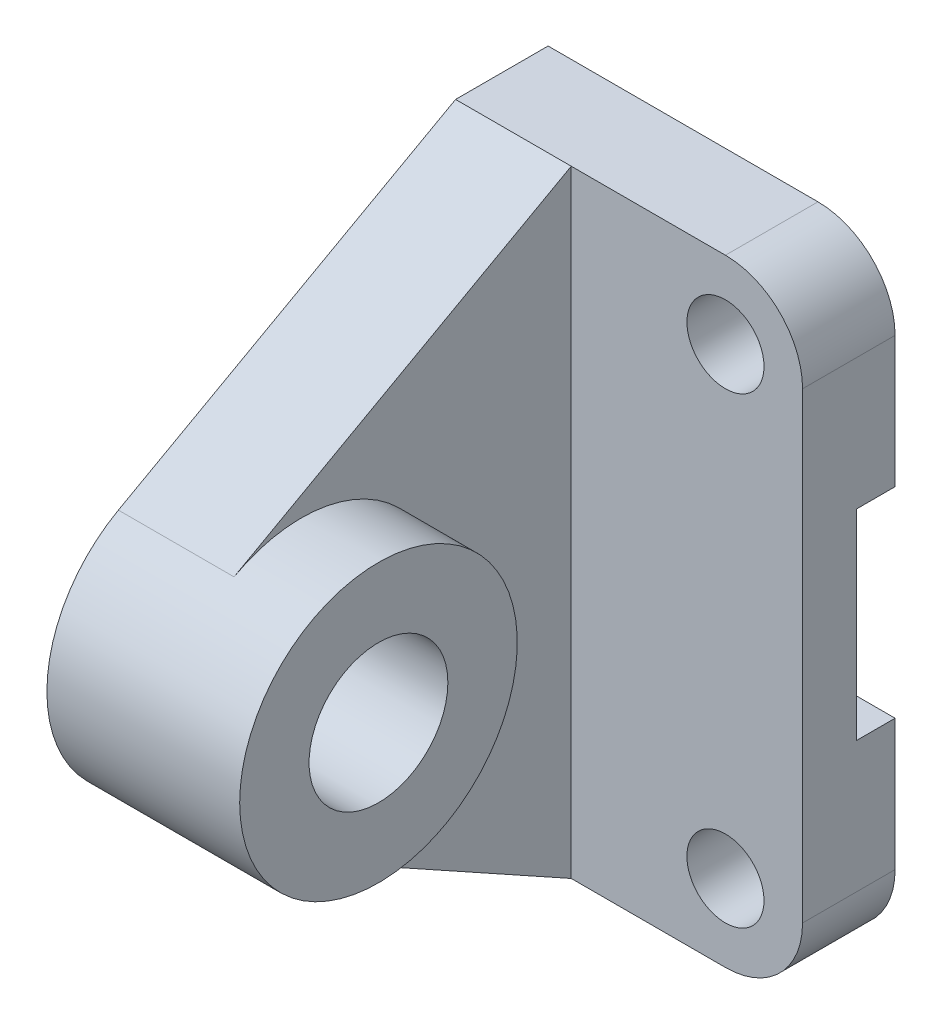
ISO-10303-21;
HEADER;
FILE_DESCRIPTION(('STEP AP214'),'2;1');
FILE_NAME('part.step','',(''),(''),'','','');
FILE_SCHEMA(('AUTOMOTIVE_DESIGN { 1 0 10303 214 1 1 1 1 }'));
ENDSEC;
DATA;
#1=APPLICATION_CONTEXT('core data for automotive mechanical design processes');
#2=APPLICATION_PROTOCOL_DEFINITION('international standard','automotive_design',2000,#1);
#3=PRODUCT_CONTEXT('',#1,'mechanical');
#4=PRODUCT('Part','Part','',(#3));
#5=PRODUCT_RELATED_PRODUCT_CATEGORY('part','',(#4));
#6=PRODUCT_DEFINITION_FORMATION('','',#4);
#7=PRODUCT_DEFINITION_CONTEXT('part definition',#1,'design');
#8=PRODUCT_DEFINITION('design','',#6,#7);
#9=PRODUCT_DEFINITION_SHAPE('','',#8);
#10=(LENGTH_UNIT() NAMED_UNIT(*) SI_UNIT(.MILLI.,.METRE.));
#11=(NAMED_UNIT(*) PLANE_ANGLE_UNIT() SI_UNIT($,.RADIAN.));
#12=(NAMED_UNIT(*) SI_UNIT($,.STERADIAN.) SOLID_ANGLE_UNIT());
#13=UNCERTAINTY_MEASURE_WITH_UNIT(LENGTH_MEASURE(1.E-05),#10,'distance_accuracy_value','');
#14=(GEOMETRIC_REPRESENTATION_CONTEXT(3) GLOBAL_UNCERTAINTY_ASSIGNED_CONTEXT((#13)) GLOBAL_UNIT_ASSIGNED_CONTEXT((#10,
#11,#12)) REPRESENTATION_CONTEXT('',''));
#15=CARTESIAN_POINT('',(0.,0.,0.));
#16=DIRECTION('',(0.,0.,1.));
#17=DIRECTION('',(1.,0.,0.));
#18=AXIS2_PLACEMENT_3D('',#15,#16,#17);
#19=CARTESIAN_POINT('',(45.,40.,0.));
#20=DIRECTION('',(0.,0.,1.));
#21=DIRECTION('',(1.,0.,0.));
#22=AXIS2_PLACEMENT_3D('',#19,#20,#21);
#23=PLANE('',#22);
#24=CARTESIAN_POINT('',(35.,30.,0.));
#25=DIRECTION('',(0.,0.,1.));
#26=DIRECTION('',(1.,0.,0.));
#27=AXIS2_PLACEMENT_3D('',#24,#25,#26);
#28=CIRCLE('',#27,5.);
#29=CARTESIAN_POINT('',(40.,30.,0.));
#30=VERTEX_POINT('',#29);
#31=EDGE_CURVE('E189',#30,#30,#28,.T.);
#32=ORIENTED_EDGE('',*,*,#31,.T.);
#33=EDGE_LOOP('',(#32));
#34=FACE_BOUND('',#33,.T.);
#35=DIRECTION('',(0.,1.,0.));
#36=VECTOR('',#35,1.);
#37=CARTESIAN_POINT('',(45.,40.,0.));
#38=LINE('',#37,#36);
#39=CARTESIAN_POINT('',(45.,13.,0.));
#40=VERTEX_POINT('',#39);
#41=CARTESIAN_POINT('',(45.,30.,0.));
#42=VERTEX_POINT('',#41);
#43=EDGE_CURVE('E205',#40,#42,#38,.T.);
#44=ORIENTED_EDGE('',*,*,#43,.F.);
#45=DIRECTION('',(-1.,0.,0.));
#46=VECTOR('',#45,1.);
#47=CARTESIAN_POINT('',(45.,13.,0.));
#48=LINE('',#47,#46);
#49=CARTESIAN_POINT('',(0.,13.,0.));
#50=VERTEX_POINT('',#49);
#51=EDGE_CURVE('E185',#40,#50,#48,.T.);
#52=ORIENTED_EDGE('',*,*,#51,.T.);
#53=DIRECTION('',(0.,1.,0.));
#54=VECTOR('',#53,1.);
#55=CARTESIAN_POINT('',(0.,40.,0.));
#56=LINE('',#55,#54);
#57=CARTESIAN_POINT('',(0.,40.,0.));
#58=VERTEX_POINT('',#57);
#59=EDGE_CURVE('E192',#50,#58,#56,.T.);
#60=ORIENTED_EDGE('',*,*,#59,.T.);
#61=DIRECTION('',(-1.,0.,0.));
#62=VECTOR('',#61,1.);
#63=CARTESIAN_POINT('',(45.,40.,0.));
#64=LINE('',#63,#62);
#65=CARTESIAN_POINT('',(35.,40.,0.));
#66=VERTEX_POINT('',#65);
#67=EDGE_CURVE('E225',#66,#58,#64,.T.);
#68=ORIENTED_EDGE('',*,*,#67,.F.);
#69=CARTESIAN_POINT('',(35.,30.,0.));
#70=DIRECTION('',(0.,0.,1.));
#71=DIRECTION('',(1.,0.,0.));
#72=AXIS2_PLACEMENT_3D('',#69,#70,#71);
#73=CIRCLE('',#72,10.);
#74=EDGE_CURVE('E242',#66,#42,#73,.F.);
#75=ORIENTED_EDGE('',*,*,#74,.T.);
#76=EDGE_LOOP('',(#44,#52,#60,#68,#75));
#77=FACE_BOUND('',#76,.T.);
#78=ADVANCED_FACE('F37',(#34,#77),#23,.F.);
#79=CARTESIAN_POINT('',(35.,-30.,0.));
#80=DIRECTION('',(0.,0.,1.));
#81=DIRECTION('',(1.,0.,0.));
#82=AXIS2_PLACEMENT_3D('',#79,#80,#81);
#83=CIRCLE('',#82,5.);
#84=CARTESIAN_POINT('',(40.,-30.,0.));
#85=VERTEX_POINT('',#84);
#86=EDGE_CURVE('E196',#85,#85,#83,.T.);
#87=ORIENTED_EDGE('',*,*,#86,.T.);
#88=EDGE_LOOP('',(#87));
#89=FACE_BOUND('',#88,.T.);
#90=CARTESIAN_POINT('',(0.,-40.,0.));
#91=VERTEX_POINT('',#90);
#92=CARTESIAN_POINT('',(0.,-13.,0.));
#93=VERTEX_POINT('',#92);
#94=EDGE_CURVE('E209',#91,#93,#56,.T.);
#95=ORIENTED_EDGE('',*,*,#94,.T.);
#96=DIRECTION('',(1.,0.,0.));
#97=VECTOR('',#96,1.);
#98=CARTESIAN_POINT('',(45.,-13.,0.));
#99=LINE('',#98,#97);
#100=CARTESIAN_POINT('',(45.,-13.,0.));
#101=VERTEX_POINT('',#100);
#102=EDGE_CURVE('E59',#93,#101,#99,.T.);
#103=ORIENTED_EDGE('',*,*,#102,.T.);
#104=CARTESIAN_POINT('',(45.,-30.,0.));
#105=VERTEX_POINT('',#104);
#106=EDGE_CURVE('E201',#105,#101,#38,.T.);
#107=ORIENTED_EDGE('',*,*,#106,.F.);
#108=CARTESIAN_POINT('',(35.,-30.,0.));
#109=DIRECTION('',(0.,0.,1.));
#110=DIRECTION('',(1.,0.,0.));
#111=AXIS2_PLACEMENT_3D('',#108,#109,#110);
#112=CIRCLE('',#111,10.);
#113=CARTESIAN_POINT('',(35.,-40.,0.));
#114=VERTEX_POINT('',#113);
#115=EDGE_CURVE('E240',#105,#114,#112,.F.);
#116=ORIENTED_EDGE('',*,*,#115,.T.);
#117=DIRECTION('',(-1.,0.,0.));
#118=VECTOR('',#117,1.);
#119=CARTESIAN_POINT('',(45.,-40.,0.));
#120=LINE('',#119,#118);
#121=EDGE_CURVE('E208',#114,#91,#120,.T.);
#122=ORIENTED_EDGE('',*,*,#121,.T.);
#123=EDGE_LOOP('',(#95,#103,#107,#116,#122));
#124=FACE_BOUND('',#123,.T.);
#125=ADVANCED_FACE('F271',(#89,#124),#23,.F.);
#126=CARTESIAN_POINT('',(45.,40.,0.));
#127=DIRECTION('',(0.,-1.,0.));
#128=DIRECTION('',(0.,0.,-1.));
#129=AXIS2_PLACEMENT_3D('',#126,#127,#128);
#130=PLANE('',#129);
#131=DIRECTION('',(-1.,0.,0.));
#132=VECTOR('',#131,1.);
#133=CARTESIAN_POINT('',(45.,40.,12.));
#134=LINE('',#133,#132);
#135=CARTESIAN_POINT('',(35.,40.,12.));
#136=VERTEX_POINT('',#135);
#137=CARTESIAN_POINT('',(15.,40.,12.));
#138=VERTEX_POINT('',#137);
#139=EDGE_CURVE('E222',#136,#138,#134,.T.);
#140=ORIENTED_EDGE('',*,*,#139,.F.);
#141=DIRECTION('',(0.,0.,1.));
#142=VECTOR('',#141,1.);
#143=CARTESIAN_POINT('',(35.,40.,0.));
#144=LINE('',#143,#142);
#145=EDGE_CURVE('E238',#136,#66,#144,.F.);
#146=ORIENTED_EDGE('',*,*,#145,.T.);
#147=ORIENTED_EDGE('',*,*,#67,.T.);
#148=DIRECTION('',(0.,0.,1.));
#149=VECTOR('',#148,1.);
#150=CARTESIAN_POINT('',(0.,40.,0.));
#151=LINE('',#150,#149);
#152=CARTESIAN_POINT('',(0.,40.,12.));
#153=VERTEX_POINT('',#152);
#154=EDGE_CURVE('E212',#58,#153,#151,.T.);
#155=ORIENTED_EDGE('',*,*,#154,.T.);
#156=DIRECTION('',(-1.,0.,0.));
#157=VECTOR('',#156,1.);
#158=CARTESIAN_POINT('',(15.,40.,12.));
#159=LINE('',#158,#157);
#160=EDGE_CURVE('E163',#138,#153,#159,.T.);
#161=ORIENTED_EDGE('',*,*,#160,.F.);
#162=EDGE_LOOP('',(#140,#146,#147,#155,#161));
#163=FACE_BOUND('',#162,.T.);
#164=ADVANCED_FACE('F283',(#163),#130,.F.);
#165=CARTESIAN_POINT('',(45.,40.,12.));
#166=DIRECTION('',(0.,0.,-1.));
#167=DIRECTION('',(-1.,0.,0.));
#168=AXIS2_PLACEMENT_3D('',#165,#166,#167);
#169=PLANE('',#168);
#170=CARTESIAN_POINT('',(35.,30.,12.));
#171=DIRECTION('',(0.,0.,1.));
#172=DIRECTION('',(1.,0.,0.));
#173=AXIS2_PLACEMENT_3D('',#170,#171,#172);
#174=CIRCLE('',#173,5.);
#175=CARTESIAN_POINT('',(40.,30.,12.));
#176=VERTEX_POINT('',#175);
#177=EDGE_CURVE('E193',#176,#176,#174,.T.);
#178=ORIENTED_EDGE('',*,*,#177,.F.);
#179=EDGE_LOOP('',(#178));
#180=FACE_BOUND('',#179,.T.);
#181=CARTESIAN_POINT('',(35.,-30.,12.));
#182=DIRECTION('',(0.,0.,1.));
#183=DIRECTION('',(1.,0.,0.));
#184=AXIS2_PLACEMENT_3D('',#181,#182,#183);
#185=CIRCLE('',#184,5.);
#186=CARTESIAN_POINT('',(40.,-30.,12.));
#187=VERTEX_POINT('',#186);
#188=EDGE_CURVE('E188',#187,#187,#185,.T.);
#189=ORIENTED_EDGE('',*,*,#188,.F.);
#190=EDGE_LOOP('',(#189));
#191=FACE_BOUND('',#190,.T.);
#192=ORIENTED_EDGE('',*,*,#139,.T.);
#193=DIRECTION('',(0.,-1.,0.));
#194=VECTOR('',#193,1.);
#195=CARTESIAN_POINT('',(15.,40.,12.));
#196=LINE('',#195,#194);
#197=CARTESIAN_POINT('',(15.,-40.,12.));
#198=VERTEX_POINT('',#197);
#199=EDGE_CURVE('E150',#138,#198,#196,.T.);
#200=ORIENTED_EDGE('',*,*,#199,.T.);
#201=DIRECTION('',(-1.,0.,0.));
#202=VECTOR('',#201,1.);
#203=CARTESIAN_POINT('',(45.,-40.,12.));
#204=LINE('',#203,#202);
#205=CARTESIAN_POINT('',(35.,-40.,12.));
#206=VERTEX_POINT('',#205);
#207=EDGE_CURVE('E219',#206,#198,#204,.T.);
#208=ORIENTED_EDGE('',*,*,#207,.F.);
#209=CARTESIAN_POINT('',(35.,-30.,12.));
#210=DIRECTION('',(0.,0.,-1.));
#211=DIRECTION('',(-1.,0.,0.));
#212=AXIS2_PLACEMENT_3D('',#209,#210,#211);
#213=CIRCLE('',#212,10.);
#214=CARTESIAN_POINT('',(45.,-30.,12.));
#215=VERTEX_POINT('',#214);
#216=EDGE_CURVE('E234',#206,#215,#213,.F.);
#217=ORIENTED_EDGE('',*,*,#216,.T.);
#218=DIRECTION('',(0.,-1.,0.));
#219=VECTOR('',#218,1.);
#220=CARTESIAN_POINT('',(45.,40.,12.));
#221=LINE('',#220,#219);
#222=CARTESIAN_POINT('',(45.,30.,12.));
#223=VERTEX_POINT('',#222);
#224=EDGE_CURVE('E204',#223,#215,#221,.T.);
#225=ORIENTED_EDGE('',*,*,#224,.F.);
#226=CARTESIAN_POINT('',(35.,30.,12.));
#227=DIRECTION('',(0.,0.,-1.));
#228=DIRECTION('',(-1.,0.,0.));
#229=AXIS2_PLACEMENT_3D('',#226,#227,#228);
#230=CIRCLE('',#229,10.);
#231=EDGE_CURVE('E236',#223,#136,#230,.F.);
#232=ORIENTED_EDGE('',*,*,#231,.T.);
#233=EDGE_LOOP('',(#192,#200,#208,#217,#225,#232));
#234=FACE_BOUND('',#233,.T.);
#235=ADVANCED_FACE('F286',(#180,#191,#234),#169,.F.);
#236=CARTESIAN_POINT('',(45.,-40.,12.));
#237=DIRECTION('',(0.,1.,0.));
#238=DIRECTION('',(0.,0.,1.));
#239=AXIS2_PLACEMENT_3D('',#236,#237,#238);
#240=PLANE('',#239);
#241=ORIENTED_EDGE('',*,*,#121,.F.);
#242=DIRECTION('',(0.,0.,-1.));
#243=VECTOR('',#242,1.);
#244=CARTESIAN_POINT('',(35.,-40.,12.));
#245=LINE('',#244,#243);
#246=EDGE_CURVE('E245',#114,#206,#245,.F.);
#247=ORIENTED_EDGE('',*,*,#246,.T.);
#248=ORIENTED_EDGE('',*,*,#207,.T.);
#249=DIRECTION('',(-1.,0.,0.));
#250=VECTOR('',#249,1.);
#251=CARTESIAN_POINT('',(15.,-40.,12.));
#252=LINE('',#251,#250);
#253=CARTESIAN_POINT('',(0.,-40.,12.));
#254=VERTEX_POINT('',#253);
#255=EDGE_CURVE('E145',#198,#254,#252,.T.);
#256=ORIENTED_EDGE('',*,*,#255,.T.);
#257=DIRECTION('',(0.,0.,-1.));
#258=VECTOR('',#257,1.);
#259=CARTESIAN_POINT('',(0.,-40.,12.));
#260=LINE('',#259,#258);
#261=EDGE_CURVE('E215',#254,#91,#260,.T.);
#262=ORIENTED_EDGE('',*,*,#261,.T.);
#263=EDGE_LOOP('',(#241,#247,#248,#256,#262));
#264=FACE_BOUND('',#263,.T.);
#265=ADVANCED_FACE('F276',(#264),#240,.F.);
#266=CARTESIAN_POINT('',(45.,0.,0.));
#267=DIRECTION('',(1.,0.,0.));
#268=DIRECTION('',(0.,0.,-1.));
#269=AXIS2_PLACEMENT_3D('',#266,#267,#268);
#270=PLANE('',#269);
#271=DIRECTION('',(0.,0.,1.));
#272=VECTOR('',#271,1.);
#273=CARTESIAN_POINT('',(45.,13.,-5.));
#274=LINE('',#273,#272);
#275=CARTESIAN_POINT('',(45.,13.,5.));
#276=VERTEX_POINT('',#275);
#277=EDGE_CURVE('E172',#40,#276,#274,.T.);
#278=ORIENTED_EDGE('',*,*,#277,.F.);
#279=ORIENTED_EDGE('',*,*,#43,.T.);
#280=DIRECTION('',(0.,0.,1.));
#281=VECTOR('',#280,1.);
#282=CARTESIAN_POINT('',(45.,30.,12.));
#283=LINE('',#282,#281);
#284=EDGE_CURVE('E231',#42,#223,#283,.T.);
#285=ORIENTED_EDGE('',*,*,#284,.T.);
#286=ORIENTED_EDGE('',*,*,#224,.T.);
#287=DIRECTION('',(0.,0.,-1.));
#288=VECTOR('',#287,1.);
#289=CARTESIAN_POINT('',(45.,-30.,0.));
#290=LINE('',#289,#288);
#291=EDGE_CURVE('E228',#215,#105,#290,.T.);
#292=ORIENTED_EDGE('',*,*,#291,.T.);
#293=ORIENTED_EDGE('',*,*,#106,.T.);
#294=DIRECTION('',(0.,0.,-1.));
#295=VECTOR('',#294,1.);
#296=CARTESIAN_POINT('',(45.,-13.,-5.));
#297=LINE('',#296,#295);
#298=CARTESIAN_POINT('',(45.,-13.,5.));
#299=VERTEX_POINT('',#298);
#300=EDGE_CURVE('E177',#299,#101,#297,.T.);
#301=ORIENTED_EDGE('',*,*,#300,.F.);
#302=DIRECTION('',(0.,-1.,0.));
#303=VECTOR('',#302,1.);
#304=CARTESIAN_POINT('',(45.,-13.,5.));
#305=LINE('',#304,#303);
#306=EDGE_CURVE('E165',#276,#299,#305,.T.);
#307=ORIENTED_EDGE('',*,*,#306,.F.);
#308=EDGE_LOOP('',(#278,#279,#285,#286,#292,#293,#301,#307));
#309=FACE_BOUND('',#308,.T.);
#310=ADVANCED_FACE('F261',(#309),#270,.T.);
#311=CARTESIAN_POINT('',(0.,0.,0.));
#312=DIRECTION('',(1.,0.,0.));
#313=DIRECTION('',(0.,0.,-1.));
#314=AXIS2_PLACEMENT_3D('',#311,#312,#313);
#315=PLANE('',#314);
#316=CARTESIAN_POINT('',(0.,0.,47.));
#317=DIRECTION('',(1.,0.,0.));
#318=DIRECTION('',(0.,0.,-1.));
#319=AXIS2_PLACEMENT_3D('',#316,#317,#318);
#320=CIRCLE('',#319,9.);
#321=CARTESIAN_POINT('',(0.,0.,38.));
#322=VERTEX_POINT('',#321);
#323=EDGE_CURVE('E349',#322,#322,#320,.T.);
#324=ORIENTED_EDGE('',*,*,#323,.T.);
#325=EDGE_LOOP('',(#324));
#326=FACE_BOUND('',#325,.T.);
#327=DIRECTION('',(0.,0.485097330976282,0.874460164604247));
#328=VECTOR('',#327,1.);
#329=CARTESIAN_POINT('',(0.,-40.,12.));
#330=LINE('',#329,#328);
#331=CARTESIAN_POINT('',(0.,-15.7402829628765,55.7317519575731));
#332=VERTEX_POINT('',#331);
#333=EDGE_CURVE('E157',#254,#332,#330,.T.);
#334=ORIENTED_EDGE('',*,*,#333,.T.);
#335=CARTESIAN_POINT('',(0.,0.,47.));
#336=DIRECTION('',(-1.,0.,0.));
#337=DIRECTION('',(0.,0.,1.));
#338=AXIS2_PLACEMENT_3D('',#335,#336,#337);
#339=CIRCLE('',#338,18.);
#340=CARTESIAN_POINT('',(0.,15.7402829628765,55.7317519575731));
#341=VERTEX_POINT('',#340);
#342=EDGE_CURVE('E141',#332,#341,#339,.T.);
#343=ORIENTED_EDGE('',*,*,#342,.T.);
#344=DIRECTION('',(0.,0.485097330976282,-0.874460164604247));
#345=VECTOR('',#344,1.);
#346=CARTESIAN_POINT('',(0.,40.,12.));
#347=LINE('',#346,#345);
#348=EDGE_CURVE('E153',#341,#153,#347,.T.);
#349=ORIENTED_EDGE('',*,*,#348,.T.);
#350=ORIENTED_EDGE('',*,*,#154,.F.);
#351=ORIENTED_EDGE('',*,*,#59,.F.);
#352=DIRECTION('',(0.,0.,1.));
#353=VECTOR('',#352,1.);
#354=CARTESIAN_POINT('',(0.,13.,0.));
#355=LINE('',#354,#353);
#356=CARTESIAN_POINT('',(0.,13.,5.));
#357=VERTEX_POINT('',#356);
#358=EDGE_CURVE('E45',#50,#357,#355,.T.);
#359=ORIENTED_EDGE('',*,*,#358,.T.);
#360=DIRECTION('',(0.,-1.,0.));
#361=VECTOR('',#360,1.);
#362=CARTESIAN_POINT('',(0.,-13.,5.));
#363=LINE('',#362,#361);
#364=CARTESIAN_POINT('',(0.,-13.,5.));
#365=VERTEX_POINT('',#364);
#366=EDGE_CURVE('E168',#357,#365,#363,.T.);
#367=ORIENTED_EDGE('',*,*,#366,.T.);
#368=DIRECTION('',(0.,0.,-1.));
#369=VECTOR('',#368,1.);
#370=CARTESIAN_POINT('',(0.,-13.,-5.));
#371=LINE('',#370,#369);
#372=EDGE_CURVE('E171',#365,#93,#371,.T.);
#373=ORIENTED_EDGE('',*,*,#372,.T.);
#374=ORIENTED_EDGE('',*,*,#94,.F.);
#375=ORIENTED_EDGE('',*,*,#261,.F.);
#376=EDGE_LOOP('',(#334,#343,#349,#350,#351,#359,#367,#373,#374,#375));
#377=FACE_BOUND('',#376,.T.);
#378=ADVANCED_FACE('F249',(#326,#377),#315,.F.);
#379=CARTESIAN_POINT('',(35.,30.,0.));
#380=DIRECTION('',(0.,0.,-1.));
#381=DIRECTION('',(-1.,0.,0.));
#382=AXIS2_PLACEMENT_3D('',#379,#380,#381);
#383=CYLINDRICAL_SURFACE('',#382,10.);
#384=ORIENTED_EDGE('',*,*,#74,.F.);
#385=ORIENTED_EDGE('',*,*,#145,.F.);
#386=ORIENTED_EDGE('',*,*,#231,.F.);
#387=ORIENTED_EDGE('',*,*,#284,.F.);
#388=EDGE_LOOP('',(#384,#385,#386,#387));
#389=FACE_BOUND('',#388,.T.);
#390=ADVANCED_FACE('F289',(#389),#383,.T.);
#391=CARTESIAN_POINT('',(35.,-30.,0.));
#392=DIRECTION('',(0.,0.,1.));
#393=DIRECTION('',(1.,0.,0.));
#394=AXIS2_PLACEMENT_3D('',#391,#392,#393);
#395=CYLINDRICAL_SURFACE('',#394,10.);
#396=ORIENTED_EDGE('',*,*,#216,.F.);
#397=ORIENTED_EDGE('',*,*,#246,.F.);
#398=ORIENTED_EDGE('',*,*,#115,.F.);
#399=ORIENTED_EDGE('',*,*,#291,.F.);
#400=EDGE_LOOP('',(#396,#397,#398,#399));
#401=FACE_BOUND('',#400,.T.);
#402=ADVANCED_FACE('F39',(#401),#395,.T.);
#403=CARTESIAN_POINT('',(35.,-30.,0.));
#404=DIRECTION('',(0.,0.,1.));
#405=DIRECTION('',(1.,0.,0.));
#406=AXIS2_PLACEMENT_3D('',#403,#404,#405);
#407=CYLINDRICAL_SURFACE('',#406,5.);
#408=ORIENTED_EDGE('',*,*,#86,.F.);
#409=EDGE_LOOP('',(#408));
#410=FACE_BOUND('',#409,.T.);
#411=ORIENTED_EDGE('',*,*,#188,.T.);
#412=EDGE_LOOP('',(#411));
#413=FACE_BOUND('',#412,.T.);
#414=ADVANCED_FACE('F295',(#410,#413),#407,.F.);
#415=CARTESIAN_POINT('',(35.,30.,0.));
#416=DIRECTION('',(0.,0.,1.));
#417=DIRECTION('',(1.,0.,0.));
#418=AXIS2_PLACEMENT_3D('',#415,#416,#417);
#419=CYLINDRICAL_SURFACE('',#418,5.);
#420=ORIENTED_EDGE('',*,*,#31,.F.);
#421=EDGE_LOOP('',(#420));
#422=FACE_BOUND('',#421,.T.);
#423=ORIENTED_EDGE('',*,*,#177,.T.);
#424=EDGE_LOOP('',(#423));
#425=FACE_BOUND('',#424,.T.);
#426=ADVANCED_FACE('F318',(#422,#425),#419,.F.);
#427=CARTESIAN_POINT('',(0.,13.,-5.));
#428=DIRECTION('',(0.,1.,0.));
#429=DIRECTION('',(0.,0.,1.));
#430=AXIS2_PLACEMENT_3D('',#427,#428,#429);
#431=PLANE('',#430);
#432=ORIENTED_EDGE('',*,*,#277,.T.);
#433=DIRECTION('',(1.,0.,0.));
#434=VECTOR('',#433,1.);
#435=CARTESIAN_POINT('',(0.,13.,5.));
#436=LINE('',#435,#434);
#437=EDGE_CURVE('E180',#357,#276,#436,.T.);
#438=ORIENTED_EDGE('',*,*,#437,.F.);
#439=ORIENTED_EDGE('',*,*,#358,.F.);
#440=ORIENTED_EDGE('',*,*,#51,.F.);
#441=EDGE_LOOP('',(#432,#438,#439,#440));
#442=FACE_BOUND('',#441,.T.);
#443=ADVANCED_FACE('F253',(#442),#431,.F.);
#444=CARTESIAN_POINT('',(0.,-13.,-5.));
#445=DIRECTION('',(0.,-1.,0.));
#446=DIRECTION('',(0.,0.,-1.));
#447=AXIS2_PLACEMENT_3D('',#444,#445,#446);
#448=PLANE('',#447);
#449=ORIENTED_EDGE('',*,*,#372,.F.);
#450=DIRECTION('',(1.,0.,0.));
#451=VECTOR('',#450,1.);
#452=CARTESIAN_POINT('',(0.,-13.,5.));
#453=LINE('',#452,#451);
#454=EDGE_CURVE('E174',#365,#299,#453,.T.);
#455=ORIENTED_EDGE('',*,*,#454,.T.);
#456=ORIENTED_EDGE('',*,*,#300,.T.);
#457=ORIENTED_EDGE('',*,*,#102,.F.);
#458=EDGE_LOOP('',(#449,#455,#456,#457));
#459=FACE_BOUND('',#458,.T.);
#460=ADVANCED_FACE('F267',(#459),#448,.F.);
#461=CARTESIAN_POINT('',(0.,-13.,5.));
#462=DIRECTION('',(0.,0.,1.));
#463=DIRECTION('',(1.,0.,0.));
#464=AXIS2_PLACEMENT_3D('',#461,#462,#463);
#465=PLANE('',#464);
#466=ORIENTED_EDGE('',*,*,#306,.T.);
#467=ORIENTED_EDGE('',*,*,#454,.F.);
#468=ORIENTED_EDGE('',*,*,#366,.F.);
#469=ORIENTED_EDGE('',*,*,#437,.T.);
#470=EDGE_LOOP('',(#466,#467,#468,#469));
#471=FACE_BOUND('',#470,.T.);
#472=ADVANCED_FACE('F266',(#471),#465,.F.);
#473=CARTESIAN_POINT('',(15.,40.,12.));
#474=DIRECTION('',(0.,0.874460164604247,0.485097330976282));
#475=DIRECTION('',(0.,-0.485097330976282,0.874460164604247));
#476=AXIS2_PLACEMENT_3D('',#473,#474,#475);
#477=PLANE('',#476);
#478=ORIENTED_EDGE('',*,*,#348,.F.);
#479=DIRECTION('',(-1.,0.,0.));
#480=VECTOR('',#479,1.);
#481=CARTESIAN_POINT('',(15.,15.7402829628765,55.7317519575731));
#482=LINE('',#481,#480);
#483=CARTESIAN_POINT('',(15.,15.7402829628765,55.7317519575731));
#484=VERTEX_POINT('',#483);
#485=EDGE_CURVE('E144',#484,#341,#482,.T.);
#486=ORIENTED_EDGE('',*,*,#485,.F.);
#487=DIRECTION('',(0.,0.485097330976282,-0.874460164604247));
#488=VECTOR('',#487,1.);
#489=CARTESIAN_POINT('',(15.,40.,12.));
#490=LINE('',#489,#488);
#491=EDGE_CURVE('E133',#484,#138,#490,.T.);
#492=ORIENTED_EDGE('',*,*,#491,.T.);
#493=ORIENTED_EDGE('',*,*,#160,.T.);
#494=EDGE_LOOP('',(#478,#486,#492,#493));
#495=FACE_BOUND('',#494,.T.);
#496=ADVANCED_FACE('F279',(#495),#477,.T.);
#497=CARTESIAN_POINT('',(15.,0.,47.));
#498=DIRECTION('',(-1.,0.,0.));
#499=DIRECTION('',(0.,0.,1.));
#500=AXIS2_PLACEMENT_3D('',#497,#498,#499);
#501=CYLINDRICAL_SURFACE('',#500,18.);
#502=ORIENTED_EDGE('',*,*,#342,.F.);
#503=DIRECTION('',(-1.,0.,0.));
#504=VECTOR('',#503,1.);
#505=CARTESIAN_POINT('',(15.,-15.7402829628765,55.7317519575731));
#506=LINE('',#505,#504);
#507=CARTESIAN_POINT('',(15.,-15.7402829628765,55.7317519575731));
#508=VERTEX_POINT('',#507);
#509=EDGE_CURVE('E137',#508,#332,#506,.T.);
#510=ORIENTED_EDGE('',*,*,#509,.F.);
#511=CARTESIAN_POINT('',(15.,0.,47.));
#512=DIRECTION('',(-1.,0.,0.));
#513=DIRECTION('',(0.,0.,1.));
#514=AXIS2_PLACEMENT_3D('',#511,#512,#513);
#515=CIRCLE('',#514,18.);
#516=EDGE_CURVE('E11',#484,#508,#515,.T.);
#517=ORIENTED_EDGE('',*,*,#516,.F.);
#518=ORIENTED_EDGE('',*,*,#485,.T.);
#519=EDGE_LOOP('',(#502,#510,#517,#518));
#520=FACE_BOUND('',#519,.T.);
#521=CARTESIAN_POINT('',(25.,0.,47.));
#522=DIRECTION('',(-1.,0.,0.));
#523=DIRECTION('',(0.,0.,1.));
#524=AXIS2_PLACEMENT_3D('',#521,#522,#523);
#525=CIRCLE('',#524,18.);
#526=CARTESIAN_POINT('',(25.,0.,65.));
#527=VERTEX_POINT('',#526);
#528=EDGE_CURVE('E159',#527,#527,#525,.T.);
#529=ORIENTED_EDGE('',*,*,#528,.T.);
#530=EDGE_LOOP('',(#529));
#531=FACE_BOUND('',#530,.T.);
#532=ADVANCED_FACE('F138',(#520,#531),#501,.T.);
#533=CARTESIAN_POINT('',(15.,-40.,12.));
#534=DIRECTION('',(0.,-0.874460164604247,0.485097330976282));
#535=DIRECTION('',(0.,-0.485097330976282,-0.874460164604247));
#536=AXIS2_PLACEMENT_3D('',#533,#534,#535);
#537=PLANE('',#536);
#538=ORIENTED_EDGE('',*,*,#333,.F.);
#539=ORIENTED_EDGE('',*,*,#255,.F.);
#540=DIRECTION('',(0.,0.485097330976282,0.874460164604247));
#541=VECTOR('',#540,1.);
#542=CARTESIAN_POINT('',(15.,-40.,12.));
#543=LINE('',#542,#541);
#544=EDGE_CURVE('E51',#198,#508,#543,.T.);
#545=ORIENTED_EDGE('',*,*,#544,.T.);
#546=ORIENTED_EDGE('',*,*,#509,.T.);
#547=EDGE_LOOP('',(#538,#539,#545,#546));
#548=FACE_BOUND('',#547,.T.);
#549=ADVANCED_FACE('F147',(#548),#537,.T.);
#550=CARTESIAN_POINT('',(15.,0.,47.));
#551=DIRECTION('',(-1.,0.,0.));
#552=DIRECTION('',(0.,0.,1.));
#553=AXIS2_PLACEMENT_3D('',#550,#551,#552);
#554=PLANE('',#553);
#555=ORIENTED_EDGE('',*,*,#491,.F.);
#556=ORIENTED_EDGE('',*,*,#516,.T.);
#557=ORIENTED_EDGE('',*,*,#544,.F.);
#558=ORIENTED_EDGE('',*,*,#199,.F.);
#559=EDGE_LOOP('',(#555,#556,#557,#558));
#560=FACE_BOUND('',#559,.T.);
#561=ADVANCED_FACE('F131',(#560),#554,.F.);
#562=CARTESIAN_POINT('',(25.,0.,47.));
#563=DIRECTION('',(-1.,0.,0.));
#564=DIRECTION('',(0.,0.,1.));
#565=AXIS2_PLACEMENT_3D('',#562,#563,#564);
#566=PLANE('',#565);
#567=CARTESIAN_POINT('',(25.,0.,47.));
#568=DIRECTION('',(1.,0.,0.));
#569=DIRECTION('',(0.,0.,-1.));
#570=AXIS2_PLACEMENT_3D('',#567,#568,#569);
#571=CIRCLE('',#570,9.);
#572=CARTESIAN_POINT('',(25.,0.,38.));
#573=VERTEX_POINT('',#572);
#574=EDGE_CURVE('E352',#573,#573,#571,.T.);
#575=ORIENTED_EDGE('',*,*,#574,.F.);
#576=EDGE_LOOP('',(#575));
#577=FACE_BOUND('',#576,.T.);
#578=ORIENTED_EDGE('',*,*,#528,.F.);
#579=EDGE_LOOP('',(#578));
#580=FACE_BOUND('',#579,.T.);
#581=ADVANCED_FACE('F337',(#577,#580),#566,.F.);
#582=CARTESIAN_POINT('',(0.,0.,47.));
#583=DIRECTION('',(1.,0.,0.));
#584=DIRECTION('',(0.,0.,-1.));
#585=AXIS2_PLACEMENT_3D('',#582,#583,#584);
#586=CYLINDRICAL_SURFACE('',#585,9.);
#587=ORIENTED_EDGE('',*,*,#323,.F.);
#588=EDGE_LOOP('',(#587));
#589=FACE_BOUND('',#588,.T.);
#590=ORIENTED_EDGE('',*,*,#574,.T.);
#591=EDGE_LOOP('',(#590));
#592=FACE_BOUND('',#591,.T.);
#593=ADVANCED_FACE('F340',(#589,#592),#586,.F.);
#594=CLOSED_SHELL('',(#78,#125,#164,#235,#265,#310,#378,#390,#402,#414,#426,#443,#460,#472,#496,
#532,#549,#561,#581,#593));
#595=MANIFOLD_SOLID_BREP('B2',#594);
#596=ADVANCED_BREP_SHAPE_REPRESENTATION('',(#18,#595),#14);
#597=SHAPE_DEFINITION_REPRESENTATION(#9,#596);
ENDSEC;
END-ISO-10303-21;
